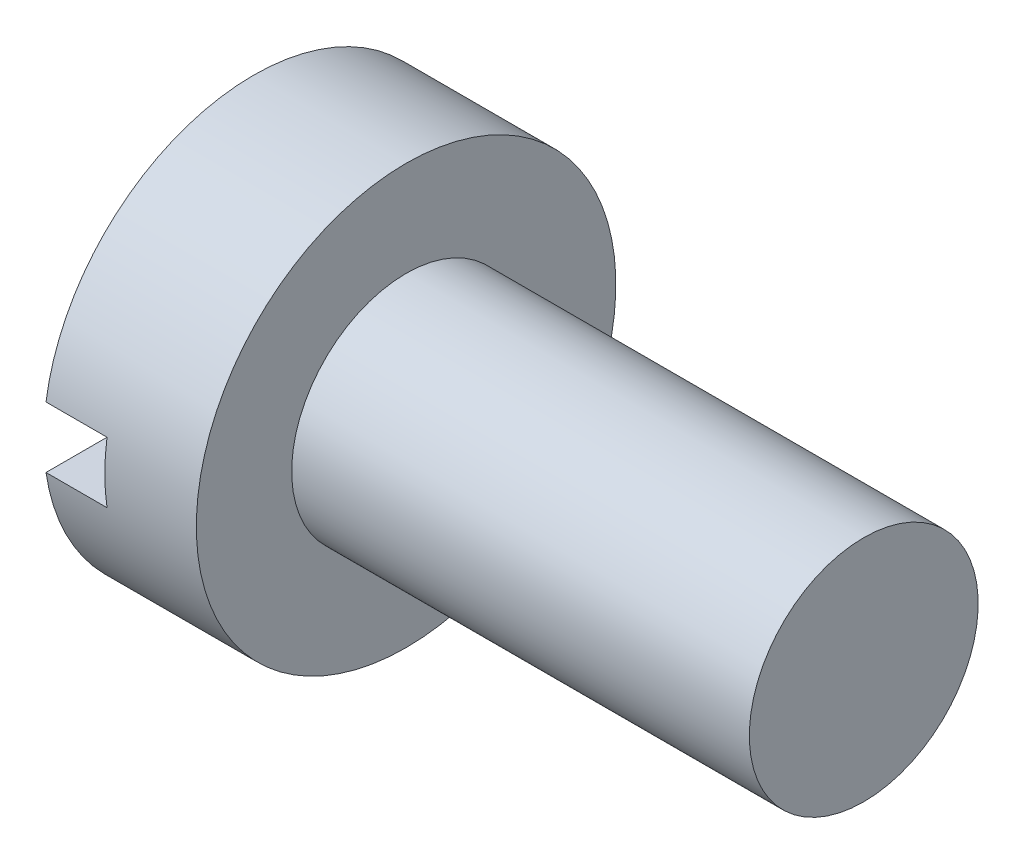
ISO-10303-21;
HEADER;
FILE_DESCRIPTION(('STEP AP214'),'2;1');
FILE_NAME('part.step','',(''),(''),'','','');
FILE_SCHEMA(('AUTOMOTIVE_DESIGN { 1 0 10303 214 1 1 1 1 }'));
ENDSEC;
DATA;
#1=APPLICATION_CONTEXT('core data for automotive mechanical design processes');
#2=APPLICATION_PROTOCOL_DEFINITION('international standard','automotive_design',2000,#1);
#3=PRODUCT_CONTEXT('',#1,'mechanical');
#4=PRODUCT('Part','Part','',(#3));
#5=PRODUCT_RELATED_PRODUCT_CATEGORY('part','',(#4));
#6=PRODUCT_DEFINITION_FORMATION('','',#4);
#7=PRODUCT_DEFINITION_CONTEXT('part definition',#1,'design');
#8=PRODUCT_DEFINITION('design','',#6,#7);
#9=PRODUCT_DEFINITION_SHAPE('','',#8);
#10=(LENGTH_UNIT() NAMED_UNIT(*) SI_UNIT(.MILLI.,.METRE.));
#11=(NAMED_UNIT(*) PLANE_ANGLE_UNIT() SI_UNIT($,.RADIAN.));
#12=(NAMED_UNIT(*) SI_UNIT($,.STERADIAN.) SOLID_ANGLE_UNIT());
#13=UNCERTAINTY_MEASURE_WITH_UNIT(LENGTH_MEASURE(1.E-05),#10,'distance_accuracy_value','');
#14=(GEOMETRIC_REPRESENTATION_CONTEXT(3) GLOBAL_UNCERTAINTY_ASSIGNED_CONTEXT((#13)) GLOBAL_UNIT_ASSIGNED_CONTEXT((#10,
#11,#12)) REPRESENTATION_CONTEXT('',''));
#15=CARTESIAN_POINT('',(0.,0.,0.));
#16=DIRECTION('',(0.,0.,1.));
#17=DIRECTION('',(1.,0.,0.));
#18=AXIS2_PLACEMENT_3D('',#15,#16,#17);
#19=CARTESIAN_POINT('',(0.,0.,0.));
#20=DIRECTION('',(-1.,0.,0.));
#21=DIRECTION('',(0.,-1.,0.));
#22=AXIS2_PLACEMENT_3D('',#19,#20,#21);
#23=PLANE('',#22);
#24=DIRECTION('',(0.,0.,-1.));
#25=VECTOR('',#24,1.);
#26=CARTESIAN_POINT('',(0.,0.399999999999997,-2.75));
#27=LINE('',#26,#25);
#28=CARTESIAN_POINT('',(0.,0.399999999999999,2.72075357208256));
#29=VERTEX_POINT('',#28);
#30=CARTESIAN_POINT('',(0.,0.399999999999997,-2.72075357208256));
#31=VERTEX_POINT('',#30);
#32=EDGE_CURVE('E83',#29,#31,#27,.T.);
#33=ORIENTED_EDGE('',*,*,#32,.F.);
#34=CARTESIAN_POINT('',(0.,0.,0.));
#35=DIRECTION('',(1.,0.,0.));
#36=DIRECTION('',(0.,1.,0.));
#37=AXIS2_PLACEMENT_3D('',#34,#35,#36);
#38=CIRCLE('',#37,2.75);
#39=EDGE_CURVE('E89',#31,#29,#38,.T.);
#40=ORIENTED_EDGE('',*,*,#39,.F.);
#41=EDGE_LOOP('',(#33,#40));
#42=FACE_BOUND('',#41,.T.);
#43=ADVANCED_FACE('F33',(#42),#23,.T.);
#44=DIRECTION('',(0.,0.,1.));
#45=VECTOR('',#44,1.);
#46=CARTESIAN_POINT('',(0.,-0.400000000000001,-2.75));
#47=LINE('',#46,#45);
#48=CARTESIAN_POINT('',(0.,-0.400000000000001,-2.72075357208256));
#49=VERTEX_POINT('',#48);
#50=CARTESIAN_POINT('',(0.,-0.399999999999999,2.72075357208256));
#51=VERTEX_POINT('',#50);
#52=EDGE_CURVE('E77',#49,#51,#47,.T.);
#53=ORIENTED_EDGE('',*,*,#52,.F.);
#54=EDGE_CURVE('E82',#51,#49,#38,.T.);
#55=ORIENTED_EDGE('',*,*,#54,.F.);
#56=EDGE_LOOP('',(#53,#55));
#57=FACE_BOUND('',#56,.T.);
#58=ADVANCED_FACE('F35',(#57),#23,.T.);
#59=CARTESIAN_POINT('',(8.,0.,0.));
#60=DIRECTION('',(1.,0.,0.));
#61=DIRECTION('',(0.,1.,0.));
#62=AXIS2_PLACEMENT_3D('',#59,#60,#61);
#63=CYLINDRICAL_SURFACE('',#62,2.75);
#64=DIRECTION('',(1.,0.,0.));
#65=VECTOR('',#64,1.);
#66=CARTESIAN_POINT('',(8.,0.399999999999997,-2.72075357208256));
#67=LINE('',#66,#65);
#68=CARTESIAN_POINT('',(0.8,0.399999999999997,-2.72075357208256));
#69=VERTEX_POINT('',#68);
#70=EDGE_CURVE('E11',#31,#69,#67,.T.);
#71=ORIENTED_EDGE('',*,*,#70,.F.);
#72=ORIENTED_EDGE('',*,*,#39,.T.);
#73=DIRECTION('',(1.,0.,0.));
#74=VECTOR('',#73,1.);
#75=CARTESIAN_POINT('',(8.,0.399999999999999,2.72075357208256));
#76=LINE('',#75,#74);
#77=CARTESIAN_POINT('',(0.8,0.399999999999999,2.72075357208256));
#78=VERTEX_POINT('',#77);
#79=EDGE_CURVE('E98',#78,#29,#76,.F.);
#80=ORIENTED_EDGE('',*,*,#79,.F.);
#81=CARTESIAN_POINT('',(0.8,0.,0.));
#82=DIRECTION('',(-1.,0.,0.));
#83=DIRECTION('',(0.,0.,1.));
#84=AXIS2_PLACEMENT_3D('',#81,#82,#83);
#85=CIRCLE('',#84,2.75);
#86=CARTESIAN_POINT('',(0.8,-0.399999999999999,2.72075357208256));
#87=VERTEX_POINT('',#86);
#88=EDGE_CURVE('E48',#78,#87,#85,.F.);
#89=ORIENTED_EDGE('',*,*,#88,.T.);
#90=DIRECTION('',(1.,0.,0.));
#91=VECTOR('',#90,1.);
#92=CARTESIAN_POINT('',(8.,-0.399999999999999,2.72075357208256));
#93=LINE('',#92,#91);
#94=EDGE_CURVE('E88',#51,#87,#93,.T.);
#95=ORIENTED_EDGE('',*,*,#94,.F.);
#96=ORIENTED_EDGE('',*,*,#54,.T.);
#97=DIRECTION('',(1.,0.,0.));
#98=VECTOR('',#97,1.);
#99=CARTESIAN_POINT('',(8.,-0.400000000000001,-2.72075357208256));
#100=LINE('',#99,#98);
#101=CARTESIAN_POINT('',(0.8,-0.400000000000001,-2.72075357208256));
#102=VERTEX_POINT('',#101);
#103=EDGE_CURVE('E41',#102,#49,#100,.F.);
#104=ORIENTED_EDGE('',*,*,#103,.F.);
#105=EDGE_CURVE('E56',#102,#69,#85,.F.);
#106=ORIENTED_EDGE('',*,*,#105,.T.);
#107=EDGE_LOOP('',(#71,#72,#80,#89,#95,#96,#104,#106));
#108=FACE_BOUND('',#107,.T.);
#109=CARTESIAN_POINT('',(2.,0.,0.));
#110=DIRECTION('',(1.,0.,0.));
#111=DIRECTION('',(0.,1.,0.));
#112=AXIS2_PLACEMENT_3D('',#109,#110,#111);
#113=CIRCLE('',#112,2.75);
#114=CARTESIAN_POINT('',(2.,2.75,0.));
#115=VERTEX_POINT('',#114);
#116=EDGE_CURVE('E93',#115,#115,#113,.T.);
#117=ORIENTED_EDGE('',*,*,#116,.F.);
#118=EDGE_LOOP('',(#117));
#119=FACE_BOUND('',#118,.T.);
#120=ADVANCED_FACE('F86',(#108,#119),#63,.T.);
#121=CARTESIAN_POINT('',(2.,2.75,0.));
#122=DIRECTION('',(1.,0.,0.));
#123=DIRECTION('',(0.,1.,0.));
#124=AXIS2_PLACEMENT_3D('',#121,#122,#123);
#125=PLANE('',#124);
#126=ORIENTED_EDGE('',*,*,#116,.T.);
#127=EDGE_LOOP('',(#126));
#128=FACE_BOUND('',#127,.T.);
#129=CARTESIAN_POINT('',(2.,0.,0.));
#130=DIRECTION('',(1.,0.,0.));
#131=DIRECTION('',(0.,1.,0.));
#132=AXIS2_PLACEMENT_3D('',#129,#130,#131);
#133=CIRCLE('',#132,1.5);
#134=CARTESIAN_POINT('',(2.,1.5,0.));
#135=VERTEX_POINT('',#134);
#136=EDGE_CURVE('E111',#135,#135,#133,.T.);
#137=ORIENTED_EDGE('',*,*,#136,.F.);
#138=EDGE_LOOP('',(#137));
#139=FACE_BOUND('',#138,.T.);
#140=ADVANCED_FACE('F118',(#128,#139),#125,.T.);
#141=CARTESIAN_POINT('',(8.,0.,0.));
#142=DIRECTION('',(1.,0.,0.));
#143=DIRECTION('',(0.,1.,0.));
#144=AXIS2_PLACEMENT_3D('',#141,#142,#143);
#145=CYLINDRICAL_SURFACE('',#144,1.5);
#146=ORIENTED_EDGE('',*,*,#136,.T.);
#147=EDGE_LOOP('',(#146));
#148=FACE_BOUND('',#147,.T.);
#149=CARTESIAN_POINT('',(8.,0.,0.));
#150=DIRECTION('',(1.,0.,0.));
#151=DIRECTION('',(0.,1.,0.));
#152=AXIS2_PLACEMENT_3D('',#149,#150,#151);
#153=CIRCLE('',#152,1.5);
#154=CARTESIAN_POINT('',(8.,1.5,0.));
#155=VERTEX_POINT('',#154);
#156=EDGE_CURVE('E109',#155,#155,#153,.T.);
#157=ORIENTED_EDGE('',*,*,#156,.F.);
#158=EDGE_LOOP('',(#157));
#159=FACE_BOUND('',#158,.T.);
#160=ADVANCED_FACE('F125',(#148,#159),#145,.T.);
#161=CARTESIAN_POINT('',(8.,1.5,0.));
#162=DIRECTION('',(1.,0.,0.));
#163=DIRECTION('',(0.,1.,0.));
#164=AXIS2_PLACEMENT_3D('',#161,#162,#163);
#165=PLANE('',#164);
#166=ORIENTED_EDGE('',*,*,#156,.T.);
#167=EDGE_LOOP('',(#166));
#168=FACE_BOUND('',#167,.T.);
#169=ADVANCED_FACE('F150',(#168),#165,.T.);
#170=CARTESIAN_POINT('',(0.8,0.399999999999997,-2.75));
#171=DIRECTION('',(0.,1.,0.));
#172=DIRECTION('',(0.,0.,1.));
#173=AXIS2_PLACEMENT_3D('',#170,#171,#172);
#174=PLANE('',#173);
#175=ORIENTED_EDGE('',*,*,#79,.T.);
#176=ORIENTED_EDGE('',*,*,#32,.T.);
#177=ORIENTED_EDGE('',*,*,#70,.T.);
#178=DIRECTION('',(0.,0.,-1.));
#179=VECTOR('',#178,1.);
#180=CARTESIAN_POINT('',(0.8,0.399999999999997,-2.75));
#181=LINE('',#180,#179);
#182=EDGE_CURVE('E105',#78,#69,#181,.T.);
#183=ORIENTED_EDGE('',*,*,#182,.F.);
#184=EDGE_LOOP('',(#175,#176,#177,#183));
#185=FACE_BOUND('',#184,.T.);
#186=ADVANCED_FACE('F145',(#185),#174,.F.);
#187=CARTESIAN_POINT('',(0.8,-0.400000000000001,-2.75));
#188=DIRECTION('',(0.,-1.,0.));
#189=DIRECTION('',(0.,0.,-1.));
#190=AXIS2_PLACEMENT_3D('',#187,#188,#189);
#191=PLANE('',#190);
#192=ORIENTED_EDGE('',*,*,#103,.T.);
#193=ORIENTED_EDGE('',*,*,#52,.T.);
#194=ORIENTED_EDGE('',*,*,#94,.T.);
#195=DIRECTION('',(0.,0.,1.));
#196=VECTOR('',#195,1.);
#197=CARTESIAN_POINT('',(0.8,-0.400000000000001,-2.75));
#198=LINE('',#197,#196);
#199=EDGE_CURVE('E78',#102,#87,#198,.T.);
#200=ORIENTED_EDGE('',*,*,#199,.F.);
#201=EDGE_LOOP('',(#192,#193,#194,#200));
#202=FACE_BOUND('',#201,.T.);
#203=ADVANCED_FACE('F76',(#202),#191,.F.);
#204=CARTESIAN_POINT('',(0.8,0.,0.));
#205=DIRECTION('',(-1.,0.,0.));
#206=DIRECTION('',(0.,0.,1.));
#207=AXIS2_PLACEMENT_3D('',#204,#205,#206);
#208=PLANE('',#207);
#209=ORIENTED_EDGE('',*,*,#199,.T.);
#210=ORIENTED_EDGE('',*,*,#88,.F.);
#211=ORIENTED_EDGE('',*,*,#182,.T.);
#212=ORIENTED_EDGE('',*,*,#105,.F.);
#213=EDGE_LOOP('',(#209,#210,#211,#212));
#214=FACE_BOUND('',#213,.T.);
#215=ADVANCED_FACE('F160',(#214),#208,.T.);
#216=CLOSED_SHELL('',(#43,#58,#120,#140,#160,#169,#186,#203,#215));
#217=MANIFOLD_SOLID_BREP('B2',#216);
#218=ADVANCED_BREP_SHAPE_REPRESENTATION('',(#18,#217),#14);
#219=SHAPE_DEFINITION_REPRESENTATION(#9,#218);
ENDSEC;
END-ISO-10303-21;
